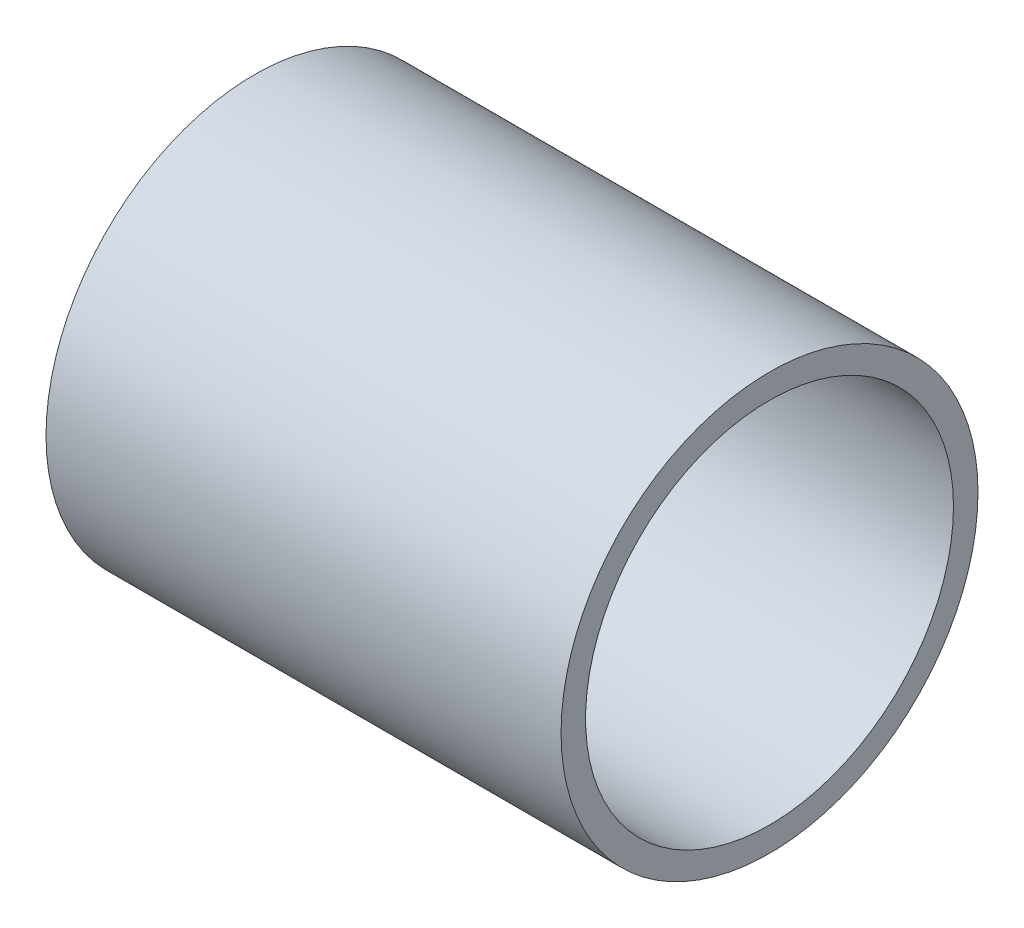
ISO-10303-21;
HEADER;
FILE_DESCRIPTION(('STEP AP214'),'2;1');
FILE_NAME('part.step','',(''),(''),'','','');
FILE_SCHEMA(('AUTOMOTIVE_DESIGN { 1 0 10303 214 1 1 1 1 }'));
ENDSEC;
DATA;
#1=APPLICATION_CONTEXT('core data for automotive mechanical design processes');
#2=APPLICATION_PROTOCOL_DEFINITION('international standard','automotive_design',2000,#1);
#3=PRODUCT_CONTEXT('',#1,'mechanical');
#4=PRODUCT('Part','Part','',(#3));
#5=PRODUCT_RELATED_PRODUCT_CATEGORY('part','',(#4));
#6=PRODUCT_DEFINITION_FORMATION('','',#4);
#7=PRODUCT_DEFINITION_CONTEXT('part definition',#1,'design');
#8=PRODUCT_DEFINITION('design','',#6,#7);
#9=PRODUCT_DEFINITION_SHAPE('','',#8);
#10=(LENGTH_UNIT() NAMED_UNIT(*) SI_UNIT(.MILLI.,.METRE.));
#11=(NAMED_UNIT(*) PLANE_ANGLE_UNIT() SI_UNIT($,.RADIAN.));
#12=(NAMED_UNIT(*) SI_UNIT($,.STERADIAN.) SOLID_ANGLE_UNIT());
#13=UNCERTAINTY_MEASURE_WITH_UNIT(LENGTH_MEASURE(1.E-05),#10,'distance_accuracy_value','');
#14=(GEOMETRIC_REPRESENTATION_CONTEXT(3) GLOBAL_UNCERTAINTY_ASSIGNED_CONTEXT((#13)) GLOBAL_UNIT_ASSIGNED_CONTEXT((#10,
#11,#12)) REPRESENTATION_CONTEXT('',''));
#15=CARTESIAN_POINT('',(0.,0.,0.));
#16=DIRECTION('',(0.,0.,1.));
#17=DIRECTION('',(1.,0.,0.));
#18=AXIS2_PLACEMENT_3D('',#15,#16,#17);
#19=CARTESIAN_POINT('',(200.,0.,0.));
#20=DIRECTION('',(-1.,0.,0.));
#21=DIRECTION('',(0.,0.,1.));
#22=AXIS2_PLACEMENT_3D('',#19,#20,#21);
#23=CYLINDRICAL_SURFACE('',#22,85.);
#24=CARTESIAN_POINT('',(200.,0.,0.));
#25=DIRECTION('',(1.,0.,0.));
#26=DIRECTION('',(0.,0.,-1.));
#27=AXIS2_PLACEMENT_3D('',#24,#25,#26);
#28=CIRCLE('',#27,85.);
#29=CARTESIAN_POINT('',(200.,0.,-85.));
#30=VERTEX_POINT('',#29);
#31=EDGE_CURVE('E10',#30,#30,#28,.T.);
#32=ORIENTED_EDGE('',*,*,#31,.F.);
#33=EDGE_LOOP('',(#32));
#34=FACE_BOUND('',#33,.T.);
#35=CARTESIAN_POINT('',(-10.,0.,0.));
#36=DIRECTION('',(1.,0.,0.));
#37=DIRECTION('',(0.,0.,-1.));
#38=AXIS2_PLACEMENT_3D('',#35,#36,#37);
#39=CIRCLE('',#38,85.);
#40=CARTESIAN_POINT('',(-10.,0.,-85.));
#41=VERTEX_POINT('',#40);
#42=EDGE_CURVE('E39',#41,#41,#39,.T.);
#43=ORIENTED_EDGE('',*,*,#42,.T.);
#44=EDGE_LOOP('',(#43));
#45=FACE_BOUND('',#44,.T.);
#46=ADVANCED_FACE('F32',(#34,#45),#23,.T.);
#47=CARTESIAN_POINT('',(200.,0.,0.));
#48=DIRECTION('',(1.,0.,0.));
#49=DIRECTION('',(0.,0.,-1.));
#50=AXIS2_PLACEMENT_3D('',#47,#48,#49);
#51=PLANE('',#50);
#52=CARTESIAN_POINT('',(200.,0.,0.));
#53=DIRECTION('',(1.,0.,0.));
#54=DIRECTION('',(0.,0.,-1.));
#55=AXIS2_PLACEMENT_3D('',#52,#53,#54);
#56=CIRCLE('',#55,75.);
#57=CARTESIAN_POINT('',(200.,0.,-75.));
#58=VERTEX_POINT('',#57);
#59=EDGE_CURVE('E43',#58,#58,#56,.T.);
#60=ORIENTED_EDGE('',*,*,#59,.F.);
#61=EDGE_LOOP('',(#60));
#62=FACE_BOUND('',#61,.T.);
#63=ORIENTED_EDGE('',*,*,#31,.T.);
#64=EDGE_LOOP('',(#63));
#65=FACE_BOUND('',#64,.T.);
#66=ADVANCED_FACE('F64',(#62,#65),#51,.T.);
#67=CARTESIAN_POINT('',(-10.,0.,0.));
#68=DIRECTION('',(1.,0.,0.));
#69=DIRECTION('',(0.,0.,-1.));
#70=AXIS2_PLACEMENT_3D('',#67,#68,#69);
#71=PLANE('',#70);
#72=ORIENTED_EDGE('',*,*,#42,.F.);
#73=EDGE_LOOP('',(#72));
#74=FACE_BOUND('',#73,.T.);
#75=ADVANCED_FACE('F34',(#74),#71,.F.);
#76=CARTESIAN_POINT('',(200.,0.,0.));
#77=DIRECTION('',(-1.,0.,0.));
#78=DIRECTION('',(0.,0.,1.));
#79=AXIS2_PLACEMENT_3D('',#76,#77,#78);
#80=CYLINDRICAL_SURFACE('',#79,75.);
#81=ORIENTED_EDGE('',*,*,#59,.T.);
#82=EDGE_LOOP('',(#81));
#83=FACE_BOUND('',#82,.T.);
#84=CARTESIAN_POINT('',(0.,0.,0.));
#85=DIRECTION('',(1.,0.,0.));
#86=DIRECTION('',(0.,0.,-1.));
#87=AXIS2_PLACEMENT_3D('',#84,#85,#86);
#88=CIRCLE('',#87,75.);
#89=CARTESIAN_POINT('',(0.,0.,-75.));
#90=VERTEX_POINT('',#89);
#91=EDGE_CURVE('E47',#90,#90,#88,.T.);
#92=ORIENTED_EDGE('',*,*,#91,.F.);
#93=EDGE_LOOP('',(#92));
#94=FACE_BOUND('',#93,.T.);
#95=ADVANCED_FACE('F55',(#83,#94),#80,.F.);
#96=CARTESIAN_POINT('',(0.,0.,0.));
#97=DIRECTION('',(1.,0.,0.));
#98=DIRECTION('',(0.,0.,-1.));
#99=AXIS2_PLACEMENT_3D('',#96,#97,#98);
#100=PLANE('',#99);
#101=ORIENTED_EDGE('',*,*,#91,.T.);
#102=EDGE_LOOP('',(#101));
#103=FACE_BOUND('',#102,.T.);
#104=ADVANCED_FACE('F53',(#103),#100,.T.);
#105=CLOSED_SHELL('',(#46,#66,#75,#95,#104));
#106=MANIFOLD_SOLID_BREP('B2',#105);
#107=ADVANCED_BREP_SHAPE_REPRESENTATION('',(#18,#106),#14);
#108=SHAPE_DEFINITION_REPRESENTATION(#9,#107);
ENDSEC;
END-ISO-10303-21;
